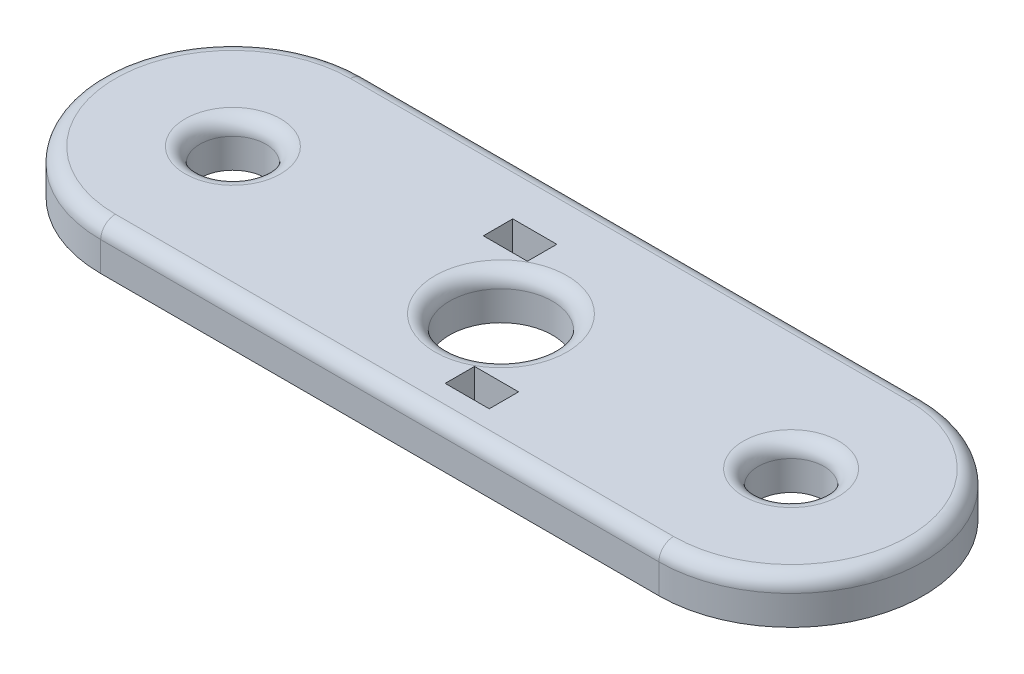
ISO-10303-21;
HEADER;
FILE_DESCRIPTION(('STEP AP214'),'2;1');
FILE_NAME('part.step','',(''),(''),'','','');
FILE_SCHEMA(('AUTOMOTIVE_DESIGN { 1 0 10303 214 1 1 1 1 }'));
ENDSEC;
DATA;
#1=APPLICATION_CONTEXT('core data for automotive mechanical design processes');
#2=APPLICATION_PROTOCOL_DEFINITION('international standard','automotive_design',2000,#1);
#3=PRODUCT_CONTEXT('',#1,'mechanical');
#4=PRODUCT('Part','Part','',(#3));
#5=PRODUCT_RELATED_PRODUCT_CATEGORY('part','',(#4));
#6=PRODUCT_DEFINITION_FORMATION('','',#4);
#7=PRODUCT_DEFINITION_CONTEXT('part definition',#1,'design');
#8=PRODUCT_DEFINITION('design','',#6,#7);
#9=PRODUCT_DEFINITION_SHAPE('','',#8);
#10=(LENGTH_UNIT() NAMED_UNIT(*) SI_UNIT(.MILLI.,.METRE.));
#11=(NAMED_UNIT(*) PLANE_ANGLE_UNIT() SI_UNIT($,.RADIAN.));
#12=(NAMED_UNIT(*) SI_UNIT($,.STERADIAN.) SOLID_ANGLE_UNIT());
#13=UNCERTAINTY_MEASURE_WITH_UNIT(LENGTH_MEASURE(1.E-05),#10,'distance_accuracy_value','');
#14=(GEOMETRIC_REPRESENTATION_CONTEXT(3) GLOBAL_UNCERTAINTY_ASSIGNED_CONTEXT((#13)) GLOBAL_UNIT_ASSIGNED_CONTEXT((#10,
#11,#12)) REPRESENTATION_CONTEXT('',''));
#15=CARTESIAN_POINT('',(0.,0.,0.));
#16=DIRECTION('',(0.,0.,1.));
#17=DIRECTION('',(1.,0.,0.));
#18=AXIS2_PLACEMENT_3D('',#15,#16,#17);
#19=CARTESIAN_POINT('',(-19.,3.,0.));
#20=DIRECTION('',(0.,1.,0.));
#21=DIRECTION('',(0.,0.,1.));
#22=AXIS2_PLACEMENT_3D('',#19,#20,#21);
#23=PLANE('',#22);
#24=CARTESIAN_POINT('',(19.,3.,0.));
#25=DIRECTION('',(0.,1.,0.));
#26=DIRECTION('',(0.,0.,1.));
#27=AXIS2_PLACEMENT_3D('',#24,#25,#26);
#28=CIRCLE('',#27,3.25);
#29=CARTESIAN_POINT('',(19.,3.,3.25));
#30=VERTEX_POINT('',#29);
#31=EDGE_CURVE('E258',#30,#30,#28,.F.);
#32=ORIENTED_EDGE('',*,*,#31,.T.);
#33=EDGE_LOOP('',(#32));
#34=FACE_BOUND('',#33,.T.);
#35=CARTESIAN_POINT('',(0.,3.,0.750000000000001));
#36=DIRECTION('',(0.,1.,0.));
#37=DIRECTION('',(0.,0.,1.));
#38=AXIS2_PLACEMENT_3D('',#35,#36,#37);
#39=CIRCLE('',#38,4.5);
#40=CARTESIAN_POINT('',(0.,3.,5.25));
#41=VERTEX_POINT('',#40);
#42=EDGE_CURVE('E255',#41,#41,#39,.F.);
#43=ORIENTED_EDGE('',*,*,#42,.T.);
#44=EDGE_LOOP('',(#43));
#45=FACE_BOUND('',#44,.T.);
#46=CARTESIAN_POINT('',(-19.,3.,0.));
#47=DIRECTION('',(0.,1.,0.));
#48=DIRECTION('',(0.,0.,1.));
#49=AXIS2_PLACEMENT_3D('',#46,#47,#48);
#50=CIRCLE('',#49,3.25);
#51=CARTESIAN_POINT('',(-19.,3.,3.25000000000001));
#52=VERTEX_POINT('',#51);
#53=EDGE_CURVE('E252',#52,#52,#50,.F.);
#54=ORIENTED_EDGE('',*,*,#53,.T.);
#55=EDGE_LOOP('',(#54));
#56=FACE_BOUND('',#55,.T.);
#57=CARTESIAN_POINT('',(19.,3.,0.));
#58=DIRECTION('',(0.,1.,0.));
#59=DIRECTION('',(0.,0.,1.));
#60=AXIS2_PLACEMENT_3D('',#57,#58,#59);
#61=CIRCLE('',#60,8.);
#62=CARTESIAN_POINT('',(19.,3.,8.));
#63=VERTEX_POINT('',#62);
#64=CARTESIAN_POINT('',(19.,3.,-7.99999999999999));
#65=VERTEX_POINT('',#64);
#66=EDGE_CURVE('E247',#63,#65,#61,.T.);
#67=ORIENTED_EDGE('',*,*,#66,.T.);
#68=DIRECTION('',(-1.,0.,0.));
#69=VECTOR('',#68,1.);
#70=CARTESIAN_POINT('',(-19.,3.,-7.99999999999999));
#71=LINE('',#70,#69);
#72=CARTESIAN_POINT('',(-19.,3.,-7.99999999999999));
#73=VERTEX_POINT('',#72);
#74=EDGE_CURVE('E249',#65,#73,#71,.T.);
#75=ORIENTED_EDGE('',*,*,#74,.T.);
#76=CARTESIAN_POINT('',(-19.,3.,0.));
#77=DIRECTION('',(0.,1.,0.));
#78=DIRECTION('',(0.,0.,1.));
#79=AXIS2_PLACEMENT_3D('',#76,#77,#78);
#80=CIRCLE('',#79,8.);
#81=CARTESIAN_POINT('',(-19.,3.,8.00000000000001));
#82=VERTEX_POINT('',#81);
#83=EDGE_CURVE('E243',#73,#82,#80,.T.);
#84=ORIENTED_EDGE('',*,*,#83,.T.);
#85=DIRECTION('',(1.,0.,0.));
#86=VECTOR('',#85,1.);
#87=CARTESIAN_POINT('',(19.,3.,8.));
#88=LINE('',#87,#86);
#89=EDGE_CURVE('E245',#82,#63,#88,.T.);
#90=ORIENTED_EDGE('',*,*,#89,.T.);
#91=EDGE_LOOP('',(#67,#75,#84,#90));
#92=FACE_BOUND('',#91,.T.);
#93=DIRECTION('',(1.,0.,0.));
#94=VECTOR('',#93,1.);
#95=CARTESIAN_POINT('',(-5.2,3.,-5.25));
#96=LINE('',#95,#94);
#97=CARTESIAN_POINT('',(-5.2,3.,-5.25));
#98=VERTEX_POINT('',#97);
#99=CARTESIAN_POINT('',(-2.2,3.,-5.25));
#100=VERTEX_POINT('',#99);
#101=EDGE_CURVE('E140',#98,#100,#96,.T.);
#102=ORIENTED_EDGE('',*,*,#101,.T.);
#103=DIRECTION('',(0.,0.,1.));
#104=VECTOR('',#103,1.);
#105=CARTESIAN_POINT('',(-2.2,3.,-3.25));
#106=LINE('',#105,#104);
#107=CARTESIAN_POINT('',(-2.2,3.,-3.25));
#108=VERTEX_POINT('',#107);
#109=EDGE_CURVE('E151',#100,#108,#106,.T.);
#110=ORIENTED_EDGE('',*,*,#109,.T.);
#111=DIRECTION('',(-1.,0.,0.));
#112=VECTOR('',#111,1.);
#113=CARTESIAN_POINT('',(-5.2,3.,-3.25));
#114=LINE('',#113,#112);
#115=CARTESIAN_POINT('',(-5.2,3.,-3.25));
#116=VERTEX_POINT('',#115);
#117=EDGE_CURVE('E156',#108,#116,#114,.T.);
#118=ORIENTED_EDGE('',*,*,#117,.T.);
#119=DIRECTION('',(0.,0.,-1.));
#120=VECTOR('',#119,1.);
#121=CARTESIAN_POINT('',(-5.2,3.,-3.25));
#122=LINE('',#121,#120);
#123=EDGE_CURVE('E147',#116,#98,#122,.T.);
#124=ORIENTED_EDGE('',*,*,#123,.T.);
#125=EDGE_LOOP('',(#102,#110,#118,#124));
#126=FACE_BOUND('',#125,.T.);
#127=DIRECTION('',(-1.,0.,0.));
#128=VECTOR('',#127,1.);
#129=CARTESIAN_POINT('',(2.2,3.,6.75));
#130=LINE('',#129,#128);
#131=CARTESIAN_POINT('',(5.2,3.,6.75));
#132=VERTEX_POINT('',#131);
#133=CARTESIAN_POINT('',(2.2,3.,6.75));
#134=VERTEX_POINT('',#133);
#135=EDGE_CURVE('E175',#132,#134,#130,.T.);
#136=ORIENTED_EDGE('',*,*,#135,.T.);
#137=DIRECTION('',(0.,0.,-1.));
#138=VECTOR('',#137,1.);
#139=CARTESIAN_POINT('',(2.2,3.,6.75));
#140=LINE('',#139,#138);
#141=CARTESIAN_POINT('',(2.2,3.,4.75));
#142=VERTEX_POINT('',#141);
#143=EDGE_CURVE('E178',#134,#142,#140,.T.);
#144=ORIENTED_EDGE('',*,*,#143,.T.);
#145=DIRECTION('',(1.,0.,0.));
#146=VECTOR('',#145,1.);
#147=CARTESIAN_POINT('',(2.2,3.,4.75));
#148=LINE('',#147,#146);
#149=CARTESIAN_POINT('',(5.2,3.,4.75));
#150=VERTEX_POINT('',#149);
#151=EDGE_CURVE('E181',#142,#150,#148,.T.);
#152=ORIENTED_EDGE('',*,*,#151,.T.);
#153=DIRECTION('',(0.,0.,1.));
#154=VECTOR('',#153,1.);
#155=CARTESIAN_POINT('',(5.2,3.,6.75));
#156=LINE('',#155,#154);
#157=EDGE_CURVE('E184',#150,#132,#156,.T.);
#158=ORIENTED_EDGE('',*,*,#157,.T.);
#159=EDGE_LOOP('',(#136,#144,#152,#158));
#160=FACE_BOUND('',#159,.T.);
#161=ADVANCED_FACE('F32',(#34,#45,#56,#92,#126,#160),#23,.T.);
#162=CARTESIAN_POINT('',(-19.,0.,0.));
#163=DIRECTION('',(0.,1.,0.));
#164=DIRECTION('',(0.,0.,1.));
#165=AXIS2_PLACEMENT_3D('',#162,#163,#164);
#166=PLANE('',#165);
#167=DIRECTION('',(0.,0.,-1.));
#168=VECTOR('',#167,1.);
#169=CARTESIAN_POINT('',(-2.2,0.,0.));
#170=LINE('',#169,#168);
#171=CARTESIAN_POINT('',(-2.2,0.,-3.25));
#172=VERTEX_POINT('',#171);
#173=CARTESIAN_POINT('',(-2.2,0.,-5.25));
#174=VERTEX_POINT('',#173);
#175=EDGE_CURVE('E234',#172,#174,#170,.T.);
#176=ORIENTED_EDGE('',*,*,#175,.T.);
#177=DIRECTION('',(-1.,0.,0.));
#178=VECTOR('',#177,1.);
#179=CARTESIAN_POINT('',(-19.,0.,-5.25));
#180=LINE('',#179,#178);
#181=CARTESIAN_POINT('',(-5.2,0.,-5.25));
#182=VERTEX_POINT('',#181);
#183=EDGE_CURVE('E143',#174,#182,#180,.T.);
#184=ORIENTED_EDGE('',*,*,#183,.T.);
#185=DIRECTION('',(0.,0.,1.));
#186=VECTOR('',#185,1.);
#187=CARTESIAN_POINT('',(-5.2,0.,0.));
#188=LINE('',#187,#186);
#189=CARTESIAN_POINT('',(-5.2,0.,-3.25));
#190=VERTEX_POINT('',#189);
#191=EDGE_CURVE('E239',#182,#190,#188,.T.);
#192=ORIENTED_EDGE('',*,*,#191,.T.);
#193=DIRECTION('',(1.,0.,0.));
#194=VECTOR('',#193,1.);
#195=CARTESIAN_POINT('',(-19.,0.,-3.25));
#196=LINE('',#195,#194);
#197=EDGE_CURVE('E236',#190,#172,#196,.T.);
#198=ORIENTED_EDGE('',*,*,#197,.T.);
#199=EDGE_LOOP('',(#176,#184,#192,#198));
#200=FACE_BOUND('',#199,.T.);
#201=DIRECTION('',(0.,0.,1.));
#202=VECTOR('',#201,1.);
#203=CARTESIAN_POINT('',(2.2,0.,0.));
#204=LINE('',#203,#202);
#205=CARTESIAN_POINT('',(2.2,0.,4.75));
#206=VERTEX_POINT('',#205);
#207=CARTESIAN_POINT('',(2.2,0.,6.75));
#208=VERTEX_POINT('',#207);
#209=EDGE_CURVE('E222',#206,#208,#204,.T.);
#210=ORIENTED_EDGE('',*,*,#209,.T.);
#211=DIRECTION('',(1.,0.,0.));
#212=VECTOR('',#211,1.);
#213=CARTESIAN_POINT('',(-19.,0.,6.75));
#214=LINE('',#213,#212);
#215=CARTESIAN_POINT('',(5.2,0.,6.75));
#216=VERTEX_POINT('',#215);
#217=EDGE_CURVE('E231',#208,#216,#214,.T.);
#218=ORIENTED_EDGE('',*,*,#217,.T.);
#219=DIRECTION('',(0.,0.,-1.));
#220=VECTOR('',#219,1.);
#221=CARTESIAN_POINT('',(5.2,0.,0.));
#222=LINE('',#221,#220);
#223=CARTESIAN_POINT('',(5.2,0.,4.75));
#224=VERTEX_POINT('',#223);
#225=EDGE_CURVE('E228',#216,#224,#222,.T.);
#226=ORIENTED_EDGE('',*,*,#225,.T.);
#227=DIRECTION('',(-1.,0.,0.));
#228=VECTOR('',#227,1.);
#229=CARTESIAN_POINT('',(-19.,0.,4.75000000000001));
#230=LINE('',#229,#228);
#231=EDGE_CURVE('E225',#224,#206,#230,.T.);
#232=ORIENTED_EDGE('',*,*,#231,.T.);
#233=EDGE_LOOP('',(#210,#218,#226,#232));
#234=FACE_BOUND('',#233,.T.);
#235=CARTESIAN_POINT('',(-19.,0.,0.));
#236=DIRECTION('',(0.,1.,0.));
#237=DIRECTION('',(0.,0.,1.));
#238=AXIS2_PLACEMENT_3D('',#235,#236,#237);
#239=CIRCLE('',#238,9.);
#240=CARTESIAN_POINT('',(-19.,0.,-8.99999999999999));
#241=VERTEX_POINT('',#240);
#242=CARTESIAN_POINT('',(-19.,0.,9.00000000000001));
#243=VERTEX_POINT('',#242);
#244=EDGE_CURVE('E202',#241,#243,#239,.T.);
#245=ORIENTED_EDGE('',*,*,#244,.F.);
#246=DIRECTION('',(-1.,0.,0.));
#247=VECTOR('',#246,1.);
#248=CARTESIAN_POINT('',(19.,0.,-9.));
#249=LINE('',#248,#247);
#250=CARTESIAN_POINT('',(19.,0.,-9.));
#251=VERTEX_POINT('',#250);
#252=EDGE_CURVE('E211',#251,#241,#249,.T.);
#253=ORIENTED_EDGE('',*,*,#252,.F.);
#254=CARTESIAN_POINT('',(19.,0.,0.));
#255=DIRECTION('',(0.,1.,0.));
#256=DIRECTION('',(0.,0.,1.));
#257=AXIS2_PLACEMENT_3D('',#254,#255,#256);
#258=CIRCLE('',#257,9.);
#259=CARTESIAN_POINT('',(19.,0.,9.));
#260=VERTEX_POINT('',#259);
#261=EDGE_CURVE('E208',#260,#251,#258,.T.);
#262=ORIENTED_EDGE('',*,*,#261,.F.);
#263=DIRECTION('',(1.,0.,0.));
#264=VECTOR('',#263,1.);
#265=CARTESIAN_POINT('',(19.,0.,9.));
#266=LINE('',#265,#264);
#267=EDGE_CURVE('E205',#243,#260,#266,.T.);
#268=ORIENTED_EDGE('',*,*,#267,.F.);
#269=EDGE_LOOP('',(#245,#253,#262,#268));
#270=FACE_BOUND('',#269,.T.);
#271=CARTESIAN_POINT('',(-19.,0.,0.));
#272=DIRECTION('',(0.,1.,0.));
#273=DIRECTION('',(0.,0.,1.));
#274=AXIS2_PLACEMENT_3D('',#271,#272,#273);
#275=CIRCLE('',#274,2.25);
#276=CARTESIAN_POINT('',(-19.,0.,2.25000000000001));
#277=VERTEX_POINT('',#276);
#278=EDGE_CURVE('E199',#277,#277,#275,.T.);
#279=ORIENTED_EDGE('',*,*,#278,.T.);
#280=EDGE_LOOP('',(#279));
#281=FACE_BOUND('',#280,.T.);
#282=CARTESIAN_POINT('',(19.,0.,0.));
#283=DIRECTION('',(0.,1.,0.));
#284=DIRECTION('',(0.,0.,1.));
#285=AXIS2_PLACEMENT_3D('',#282,#283,#284);
#286=CIRCLE('',#285,2.25);
#287=CARTESIAN_POINT('',(19.,0.,2.25));
#288=VERTEX_POINT('',#287);
#289=EDGE_CURVE('E196',#288,#288,#286,.T.);
#290=ORIENTED_EDGE('',*,*,#289,.T.);
#291=EDGE_LOOP('',(#290));
#292=FACE_BOUND('',#291,.T.);
#293=CARTESIAN_POINT('',(0.,0.,0.750000000000001));
#294=DIRECTION('',(0.,1.,0.));
#295=DIRECTION('',(0.,0.,1.));
#296=AXIS2_PLACEMENT_3D('',#293,#294,#295);
#297=CIRCLE('',#296,3.5);
#298=CARTESIAN_POINT('',(0.,0.,4.25));
#299=VERTEX_POINT('',#298);
#300=EDGE_CURVE('E170',#299,#299,#297,.T.);
#301=ORIENTED_EDGE('',*,*,#300,.T.);
#302=EDGE_LOOP('',(#301));
#303=FACE_BOUND('',#302,.T.);
#304=ADVANCED_FACE('F307',(#200,#234,#270,#281,#292,#303),#166,.F.);
#305=CARTESIAN_POINT('',(-19.,3.,0.));
#306=DIRECTION('',(0.,-1.,0.));
#307=DIRECTION('',(0.,0.,-1.));
#308=AXIS2_PLACEMENT_3D('',#305,#306,#307);
#309=CYLINDRICAL_SURFACE('',#308,9.);
#310=DIRECTION('',(0.,-1.,0.));
#311=VECTOR('',#310,1.);
#312=CARTESIAN_POINT('',(-19.,3.,9.00000000000001));
#313=LINE('',#312,#311);
#314=CARTESIAN_POINT('',(-19.,2.,9.00000000000001));
#315=VERTEX_POINT('',#314);
#316=EDGE_CURVE('E220',#315,#243,#313,.T.);
#317=ORIENTED_EDGE('',*,*,#316,.F.);
#318=CARTESIAN_POINT('',(-19.,2.,0.));
#319=DIRECTION('',(0.,1.,0.));
#320=DIRECTION('',(0.,0.,1.));
#321=AXIS2_PLACEMENT_3D('',#318,#319,#320);
#322=CIRCLE('',#321,9.);
#323=CARTESIAN_POINT('',(-19.,2.,-8.99999999999999));
#324=VERTEX_POINT('',#323);
#325=EDGE_CURVE('E11',#315,#324,#322,.F.);
#326=ORIENTED_EDGE('',*,*,#325,.T.);
#327=DIRECTION('',(0.,-1.,0.));
#328=VECTOR('',#327,1.);
#329=CARTESIAN_POINT('',(-19.,3.,-8.99999999999999));
#330=LINE('',#329,#328);
#331=EDGE_CURVE('E214',#324,#241,#330,.T.);
#332=ORIENTED_EDGE('',*,*,#331,.T.);
#333=ORIENTED_EDGE('',*,*,#244,.T.);
#334=EDGE_LOOP('',(#317,#326,#332,#333));
#335=FACE_BOUND('',#334,.T.);
#336=ADVANCED_FACE('F296',(#335),#309,.T.);
#337=CARTESIAN_POINT('',(19.,3.,9.));
#338=DIRECTION('',(0.,0.,-1.));
#339=DIRECTION('',(-1.,0.,0.));
#340=AXIS2_PLACEMENT_3D('',#337,#338,#339);
#341=PLANE('',#340);
#342=DIRECTION('',(0.,-1.,0.));
#343=VECTOR('',#342,1.);
#344=CARTESIAN_POINT('',(19.,3.,9.));
#345=LINE('',#344,#343);
#346=CARTESIAN_POINT('',(19.,2.,9.));
#347=VERTEX_POINT('',#346);
#348=EDGE_CURVE('E218',#347,#260,#345,.T.);
#349=ORIENTED_EDGE('',*,*,#348,.F.);
#350=DIRECTION('',(1.,0.,0.));
#351=VECTOR('',#350,1.);
#352=CARTESIAN_POINT('',(-19.,2.,9.00000000000001));
#353=LINE('',#352,#351);
#354=EDGE_CURVE('E49',#347,#315,#353,.F.);
#355=ORIENTED_EDGE('',*,*,#354,.T.);
#356=ORIENTED_EDGE('',*,*,#316,.T.);
#357=ORIENTED_EDGE('',*,*,#267,.T.);
#358=EDGE_LOOP('',(#349,#355,#356,#357));
#359=FACE_BOUND('',#358,.T.);
#360=ADVANCED_FACE('F325',(#359),#341,.F.);
#361=CARTESIAN_POINT('',(19.,3.,0.));
#362=DIRECTION('',(0.,-1.,0.));
#363=DIRECTION('',(0.,0.,-1.));
#364=AXIS2_PLACEMENT_3D('',#361,#362,#363);
#365=CYLINDRICAL_SURFACE('',#364,9.);
#366=DIRECTION('',(0.,-1.,0.));
#367=VECTOR('',#366,1.);
#368=CARTESIAN_POINT('',(19.,3.,-9.));
#369=LINE('',#368,#367);
#370=CARTESIAN_POINT('',(19.,2.,-9.));
#371=VERTEX_POINT('',#370);
#372=EDGE_CURVE('E216',#371,#251,#369,.T.);
#373=ORIENTED_EDGE('',*,*,#372,.F.);
#374=CARTESIAN_POINT('',(19.,2.,0.));
#375=DIRECTION('',(0.,1.,0.));
#376=DIRECTION('',(0.,0.,1.));
#377=AXIS2_PLACEMENT_3D('',#374,#375,#376);
#378=CIRCLE('',#377,9.);
#379=EDGE_CURVE('E57',#371,#347,#378,.F.);
#380=ORIENTED_EDGE('',*,*,#379,.T.);
#381=ORIENTED_EDGE('',*,*,#348,.T.);
#382=ORIENTED_EDGE('',*,*,#261,.T.);
#383=EDGE_LOOP('',(#373,#380,#381,#382));
#384=FACE_BOUND('',#383,.T.);
#385=ADVANCED_FACE('F322',(#384),#365,.T.);
#386=CARTESIAN_POINT('',(19.,3.,-9.));
#387=DIRECTION('',(0.,0.,1.));
#388=DIRECTION('',(1.,0.,0.));
#389=AXIS2_PLACEMENT_3D('',#386,#387,#388);
#390=PLANE('',#389);
#391=ORIENTED_EDGE('',*,*,#331,.F.);
#392=DIRECTION('',(-1.,0.,0.));
#393=VECTOR('',#392,1.);
#394=CARTESIAN_POINT('',(19.,2.,-9.));
#395=LINE('',#394,#393);
#396=EDGE_CURVE('E261',#324,#371,#395,.F.);
#397=ORIENTED_EDGE('',*,*,#396,.T.);
#398=ORIENTED_EDGE('',*,*,#372,.T.);
#399=ORIENTED_EDGE('',*,*,#252,.T.);
#400=EDGE_LOOP('',(#391,#397,#398,#399));
#401=FACE_BOUND('',#400,.T.);
#402=ADVANCED_FACE('F299',(#401),#390,.F.);
#403=CARTESIAN_POINT('',(-19.,3.,0.));
#404=DIRECTION('',(0.,-1.,0.));
#405=DIRECTION('',(0.,0.,-1.));
#406=AXIS2_PLACEMENT_3D('',#403,#404,#405);
#407=CYLINDRICAL_SURFACE('',#406,2.25);
#408=CARTESIAN_POINT('',(-19.,2.,0.));
#409=DIRECTION('',(0.,1.,0.));
#410=DIRECTION('',(0.,0.,1.));
#411=AXIS2_PLACEMENT_3D('',#408,#409,#410);
#412=CIRCLE('',#411,2.25);
#413=CARTESIAN_POINT('',(-19.,2.,2.25000000000001));
#414=VERTEX_POINT('',#413);
#415=EDGE_CURVE('E41',#414,#414,#412,.T.);
#416=ORIENTED_EDGE('',*,*,#415,.T.);
#417=EDGE_LOOP('',(#416));
#418=FACE_BOUND('',#417,.T.);
#419=ORIENTED_EDGE('',*,*,#278,.F.);
#420=EDGE_LOOP('',(#419));
#421=FACE_BOUND('',#420,.T.);
#422=ADVANCED_FACE('F317',(#418,#421),#407,.F.);
#423=CARTESIAN_POINT('',(19.,3.,0.));
#424=DIRECTION('',(0.,-1.,0.));
#425=DIRECTION('',(0.,0.,-1.));
#426=AXIS2_PLACEMENT_3D('',#423,#424,#425);
#427=CYLINDRICAL_SURFACE('',#426,2.25);
#428=CARTESIAN_POINT('',(19.,2.,0.));
#429=DIRECTION('',(0.,1.,0.));
#430=DIRECTION('',(0.,0.,1.));
#431=AXIS2_PLACEMENT_3D('',#428,#429,#430);
#432=CIRCLE('',#431,2.25);
#433=CARTESIAN_POINT('',(19.,2.,2.25));
#434=VERTEX_POINT('',#433);
#435=EDGE_CURVE('E266',#434,#434,#432,.T.);
#436=ORIENTED_EDGE('',*,*,#435,.T.);
#437=EDGE_LOOP('',(#436));
#438=FACE_BOUND('',#437,.T.);
#439=ORIENTED_EDGE('',*,*,#289,.F.);
#440=EDGE_LOOP('',(#439));
#441=FACE_BOUND('',#440,.T.);
#442=ADVANCED_FACE('F356',(#438,#441),#427,.F.);
#443=CARTESIAN_POINT('',(0.,3.,0.750000000000001));
#444=DIRECTION('',(0.,-1.,0.));
#445=DIRECTION('',(0.,0.,-1.));
#446=AXIS2_PLACEMENT_3D('',#443,#444,#445);
#447=CYLINDRICAL_SURFACE('',#446,3.5);
#448=CARTESIAN_POINT('',(0.,2.,0.750000000000001));
#449=DIRECTION('',(0.,1.,0.));
#450=DIRECTION('',(0.,0.,1.));
#451=AXIS2_PLACEMENT_3D('',#448,#449,#450);
#452=CIRCLE('',#451,3.5);
#453=CARTESIAN_POINT('',(0.,2.,4.25));
#454=VERTEX_POINT('',#453);
#455=EDGE_CURVE('E269',#454,#454,#452,.T.);
#456=ORIENTED_EDGE('',*,*,#455,.T.);
#457=EDGE_LOOP('',(#456));
#458=FACE_BOUND('',#457,.T.);
#459=ORIENTED_EDGE('',*,*,#300,.F.);
#460=EDGE_LOOP('',(#459));
#461=FACE_BOUND('',#460,.T.);
#462=ADVANCED_FACE('F352',(#458,#461),#447,.F.);
#463=CARTESIAN_POINT('',(2.2,3.,6.75));
#464=DIRECTION('',(0.,0.,1.));
#465=DIRECTION('',(1.,0.,0.));
#466=AXIS2_PLACEMENT_3D('',#463,#464,#465);
#467=PLANE('',#466);
#468=DIRECTION('',(0.,-1.,0.));
#469=VECTOR('',#468,1.);
#470=CARTESIAN_POINT('',(2.2,3.,6.75));
#471=LINE('',#470,#469);
#472=EDGE_CURVE('E186',#134,#208,#471,.T.);
#473=ORIENTED_EDGE('',*,*,#472,.F.);
#474=ORIENTED_EDGE('',*,*,#135,.F.);
#475=DIRECTION('',(0.,-1.,0.));
#476=VECTOR('',#475,1.);
#477=CARTESIAN_POINT('',(5.2,3.,6.75));
#478=LINE('',#477,#476);
#479=EDGE_CURVE('E160',#132,#216,#478,.T.);
#480=ORIENTED_EDGE('',*,*,#479,.T.);
#481=ORIENTED_EDGE('',*,*,#217,.F.);
#482=EDGE_LOOP('',(#473,#474,#480,#481));
#483=FACE_BOUND('',#482,.T.);
#484=ADVANCED_FACE('F355',(#483),#467,.F.);
#485=CARTESIAN_POINT('',(5.2,3.,6.75));
#486=DIRECTION('',(1.,0.,0.));
#487=DIRECTION('',(0.,0.,-1.));
#488=AXIS2_PLACEMENT_3D('',#485,#486,#487);
#489=PLANE('',#488);
#490=ORIENTED_EDGE('',*,*,#479,.F.);
#491=ORIENTED_EDGE('',*,*,#157,.F.);
#492=DIRECTION('',(0.,-1.,0.));
#493=VECTOR('',#492,1.);
#494=CARTESIAN_POINT('',(5.2,3.,4.75));
#495=LINE('',#494,#493);
#496=EDGE_CURVE('E163',#150,#224,#495,.T.);
#497=ORIENTED_EDGE('',*,*,#496,.T.);
#498=ORIENTED_EDGE('',*,*,#225,.F.);
#499=EDGE_LOOP('',(#490,#491,#497,#498));
#500=FACE_BOUND('',#499,.T.);
#501=ADVANCED_FACE('F364',(#500),#489,.F.);
#502=CARTESIAN_POINT('',(2.2,3.,4.75));
#503=DIRECTION('',(0.,0.,-1.));
#504=DIRECTION('',(-1.,0.,0.));
#505=AXIS2_PLACEMENT_3D('',#502,#503,#504);
#506=PLANE('',#505);
#507=ORIENTED_EDGE('',*,*,#496,.F.);
#508=ORIENTED_EDGE('',*,*,#151,.F.);
#509=DIRECTION('',(0.,-1.,0.));
#510=VECTOR('',#509,1.);
#511=CARTESIAN_POINT('',(2.2,3.,4.75));
#512=LINE('',#511,#510);
#513=EDGE_CURVE('E190',#142,#206,#512,.T.);
#514=ORIENTED_EDGE('',*,*,#513,.T.);
#515=ORIENTED_EDGE('',*,*,#231,.F.);
#516=EDGE_LOOP('',(#507,#508,#514,#515));
#517=FACE_BOUND('',#516,.T.);
#518=ADVANCED_FACE('F372',(#517),#506,.F.);
#519=CARTESIAN_POINT('',(2.2,3.,6.75));
#520=DIRECTION('',(-1.,0.,0.));
#521=DIRECTION('',(0.,0.,1.));
#522=AXIS2_PLACEMENT_3D('',#519,#520,#521);
#523=PLANE('',#522);
#524=ORIENTED_EDGE('',*,*,#513,.F.);
#525=ORIENTED_EDGE('',*,*,#143,.F.);
#526=ORIENTED_EDGE('',*,*,#472,.T.);
#527=ORIENTED_EDGE('',*,*,#209,.F.);
#528=EDGE_LOOP('',(#524,#525,#526,#527));
#529=FACE_BOUND('',#528,.T.);
#530=ADVANCED_FACE('F369',(#529),#523,.F.);
#531=CARTESIAN_POINT('',(-5.2,3.,-5.25));
#532=DIRECTION('',(0.,0.,-1.));
#533=DIRECTION('',(-1.,0.,0.));
#534=AXIS2_PLACEMENT_3D('',#531,#532,#533);
#535=PLANE('',#534);
#536=DIRECTION('',(0.,-1.,0.));
#537=VECTOR('',#536,1.);
#538=CARTESIAN_POINT('',(-2.2,3.,-5.25));
#539=LINE('',#538,#537);
#540=EDGE_CURVE('E135',#100,#174,#539,.T.);
#541=ORIENTED_EDGE('',*,*,#540,.F.);
#542=ORIENTED_EDGE('',*,*,#101,.F.);
#543=DIRECTION('',(0.,-1.,0.));
#544=VECTOR('',#543,1.);
#545=CARTESIAN_POINT('',(-5.2,3.,-5.25));
#546=LINE('',#545,#544);
#547=EDGE_CURVE('E168',#98,#182,#546,.T.);
#548=ORIENTED_EDGE('',*,*,#547,.T.);
#549=ORIENTED_EDGE('',*,*,#183,.F.);
#550=EDGE_LOOP('',(#541,#542,#548,#549));
#551=FACE_BOUND('',#550,.T.);
#552=ADVANCED_FACE('F137',(#551),#535,.F.);
#553=CARTESIAN_POINT('',(-5.2,3.,-3.25));
#554=DIRECTION('',(-1.,0.,0.));
#555=DIRECTION('',(0.,0.,1.));
#556=AXIS2_PLACEMENT_3D('',#553,#554,#555);
#557=PLANE('',#556);
#558=ORIENTED_EDGE('',*,*,#547,.F.);
#559=ORIENTED_EDGE('',*,*,#123,.F.);
#560=DIRECTION('',(0.,-1.,0.));
#561=VECTOR('',#560,1.);
#562=CARTESIAN_POINT('',(-5.2,3.,-3.25));
#563=LINE('',#562,#561);
#564=EDGE_CURVE('E171',#116,#190,#563,.T.);
#565=ORIENTED_EDGE('',*,*,#564,.T.);
#566=ORIENTED_EDGE('',*,*,#191,.F.);
#567=EDGE_LOOP('',(#558,#559,#565,#566));
#568=FACE_BOUND('',#567,.T.);
#569=ADVANCED_FACE('F382',(#568),#557,.F.);
#570=CARTESIAN_POINT('',(-5.2,3.,-3.25));
#571=DIRECTION('',(0.,0.,1.));
#572=DIRECTION('',(1.,0.,0.));
#573=AXIS2_PLACEMENT_3D('',#570,#571,#572);
#574=PLANE('',#573);
#575=ORIENTED_EDGE('',*,*,#564,.F.);
#576=ORIENTED_EDGE('',*,*,#117,.F.);
#577=DIRECTION('',(0.,-1.,0.));
#578=VECTOR('',#577,1.);
#579=CARTESIAN_POINT('',(-2.2,3.,-3.25));
#580=LINE('',#579,#578);
#581=EDGE_CURVE('E146',#108,#172,#580,.T.);
#582=ORIENTED_EDGE('',*,*,#581,.T.);
#583=ORIENTED_EDGE('',*,*,#197,.F.);
#584=EDGE_LOOP('',(#575,#576,#582,#583));
#585=FACE_BOUND('',#584,.T.);
#586=ADVANCED_FACE('F385',(#585),#574,.F.);
#587=CARTESIAN_POINT('',(-2.2,3.,-3.25));
#588=DIRECTION('',(1.,0.,0.));
#589=DIRECTION('',(0.,0.,-1.));
#590=AXIS2_PLACEMENT_3D('',#587,#588,#589);
#591=PLANE('',#590);
#592=ORIENTED_EDGE('',*,*,#581,.F.);
#593=ORIENTED_EDGE('',*,*,#109,.F.);
#594=ORIENTED_EDGE('',*,*,#540,.T.);
#595=ORIENTED_EDGE('',*,*,#175,.F.);
#596=EDGE_LOOP('',(#592,#593,#594,#595));
#597=FACE_BOUND('',#596,.T.);
#598=ADVANCED_FACE('F152',(#597),#591,.F.);
#599=CARTESIAN_POINT('',(-19.,2.,8.00000000000001));
#600=DIRECTION('',(-1.,0.,0.));
#601=DIRECTION('',(0.,0.,1.));
#602=AXIS2_PLACEMENT_3D('',#599,#600,#601);
#603=CYLINDRICAL_SURFACE('',#602,1.);
#604=CARTESIAN_POINT('',(-19.,2.,8.00000000000001));
#605=DIRECTION('',(-1.,0.,0.));
#606=DIRECTION('',(0.,0.,1.));
#607=AXIS2_PLACEMENT_3D('',#604,#605,#606);
#608=CIRCLE('',#607,1.);
#609=EDGE_CURVE('E277',#315,#82,#608,.T.);
#610=ORIENTED_EDGE('',*,*,#609,.F.);
#611=ORIENTED_EDGE('',*,*,#354,.F.);
#612=CARTESIAN_POINT('',(19.,2.,8.));
#613=DIRECTION('',(1.,0.,0.));
#614=DIRECTION('',(0.,0.,-1.));
#615=AXIS2_PLACEMENT_3D('',#612,#613,#614);
#616=CIRCLE('',#615,1.);
#617=EDGE_CURVE('E36',#63,#347,#616,.T.);
#618=ORIENTED_EDGE('',*,*,#617,.F.);
#619=ORIENTED_EDGE('',*,*,#89,.F.);
#620=EDGE_LOOP('',(#610,#611,#618,#619));
#621=FACE_BOUND('',#620,.T.);
#622=ADVANCED_FACE('F291',(#621),#603,.T.);
#623=CARTESIAN_POINT('',(19.,2.,0.));
#624=DIRECTION('',(0.,1.,0.));
#625=DIRECTION('',(0.,0.,1.));
#626=AXIS2_PLACEMENT_3D('',#623,#624,#625);
#627=TOROIDAL_SURFACE('',#626,8.,1.);
#628=ORIENTED_EDGE('',*,*,#617,.T.);
#629=ORIENTED_EDGE('',*,*,#379,.F.);
#630=CARTESIAN_POINT('',(19.,2.,-7.99999999999999));
#631=DIRECTION('',(-1.,0.,0.));
#632=DIRECTION('',(0.,0.,1.));
#633=AXIS2_PLACEMENT_3D('',#630,#631,#632);
#634=CIRCLE('',#633,1.);
#635=EDGE_CURVE('E276',#65,#371,#634,.T.);
#636=ORIENTED_EDGE('',*,*,#635,.F.);
#637=ORIENTED_EDGE('',*,*,#66,.F.);
#638=EDGE_LOOP('',(#628,#629,#636,#637));
#639=FACE_BOUND('',#638,.T.);
#640=ADVANCED_FACE('F287',(#639),#627,.T.);
#641=CARTESIAN_POINT('',(-19.,2.,0.));
#642=DIRECTION('',(0.,1.,0.));
#643=DIRECTION('',(0.,0.,1.));
#644=AXIS2_PLACEMENT_3D('',#641,#642,#643);
#645=TOROIDAL_SURFACE('',#644,8.,1.);
#646=ORIENTED_EDGE('',*,*,#609,.T.);
#647=ORIENTED_EDGE('',*,*,#83,.F.);
#648=CARTESIAN_POINT('',(-19.,2.,-7.99999999999999));
#649=DIRECTION('',(1.,0.,0.));
#650=DIRECTION('',(0.,0.,-1.));
#651=AXIS2_PLACEMENT_3D('',#648,#649,#650);
#652=CIRCLE('',#651,1.);
#653=EDGE_CURVE('E274',#324,#73,#652,.T.);
#654=ORIENTED_EDGE('',*,*,#653,.F.);
#655=ORIENTED_EDGE('',*,*,#325,.F.);
#656=EDGE_LOOP('',(#646,#647,#654,#655));
#657=FACE_BOUND('',#656,.T.);
#658=ADVANCED_FACE('F293',(#657),#645,.T.);
#659=CARTESIAN_POINT('',(-19.,2.,-7.99999999999999));
#660=DIRECTION('',(1.,0.,0.));
#661=DIRECTION('',(0.,0.,-1.));
#662=AXIS2_PLACEMENT_3D('',#659,#660,#661);
#663=CYLINDRICAL_SURFACE('',#662,1.);
#664=ORIENTED_EDGE('',*,*,#635,.T.);
#665=ORIENTED_EDGE('',*,*,#396,.F.);
#666=ORIENTED_EDGE('',*,*,#653,.T.);
#667=ORIENTED_EDGE('',*,*,#74,.F.);
#668=EDGE_LOOP('',(#664,#665,#666,#667));
#669=FACE_BOUND('',#668,.T.);
#670=ADVANCED_FACE('F303',(#669),#663,.T.);
#671=CARTESIAN_POINT('',(19.,2.,0.));
#672=DIRECTION('',(0.,1.,0.));
#673=DIRECTION('',(0.,0.,1.));
#674=AXIS2_PLACEMENT_3D('',#671,#672,#673);
#675=TOROIDAL_SURFACE('',#674,3.25,1.);
#676=ORIENTED_EDGE('',*,*,#31,.F.);
#677=EDGE_LOOP('',(#676));
#678=FACE_BOUND('',#677,.T.);
#679=ORIENTED_EDGE('',*,*,#435,.F.);
#680=EDGE_LOOP('',(#679));
#681=FACE_BOUND('',#680,.T.);
#682=ADVANCED_FACE('F332',(#678,#681),#675,.T.);
#683=CARTESIAN_POINT('',(0.,2.,0.750000000000001));
#684=DIRECTION('',(0.,1.,0.));
#685=DIRECTION('',(0.,0.,1.));
#686=AXIS2_PLACEMENT_3D('',#683,#684,#685);
#687=TOROIDAL_SURFACE('',#686,4.5,1.);
#688=ORIENTED_EDGE('',*,*,#42,.F.);
#689=EDGE_LOOP('',(#688));
#690=FACE_BOUND('',#689,.T.);
#691=ORIENTED_EDGE('',*,*,#455,.F.);
#692=EDGE_LOOP('',(#691));
#693=FACE_BOUND('',#692,.T.);
#694=ADVANCED_FACE('F340',(#690,#693),#687,.T.);
#695=CARTESIAN_POINT('',(-19.,2.,0.));
#696=DIRECTION('',(0.,1.,0.));
#697=DIRECTION('',(0.,0.,1.));
#698=AXIS2_PLACEMENT_3D('',#695,#696,#697);
#699=TOROIDAL_SURFACE('',#698,3.25,1.);
#700=ORIENTED_EDGE('',*,*,#53,.F.);
#701=EDGE_LOOP('',(#700));
#702=FACE_BOUND('',#701,.T.);
#703=ORIENTED_EDGE('',*,*,#415,.F.);
#704=EDGE_LOOP('',(#703));
#705=FACE_BOUND('',#704,.T.);
#706=ADVANCED_FACE('F34',(#702,#705),#699,.T.);
#707=CLOSED_SHELL('',(#161,#304,#336,#360,#385,#402,#422,#442,#462,#484,#501,#518,#530,#552,
#569,#586,#598,#622,#640,#658,#670,#682,#694,#706));
#708=MANIFOLD_SOLID_BREP('B2',#707);
#709=ADVANCED_BREP_SHAPE_REPRESENTATION('',(#18,#708),#14);
#710=SHAPE_DEFINITION_REPRESENTATION(#9,#709);
ENDSEC;
END-ISO-10303-21;
